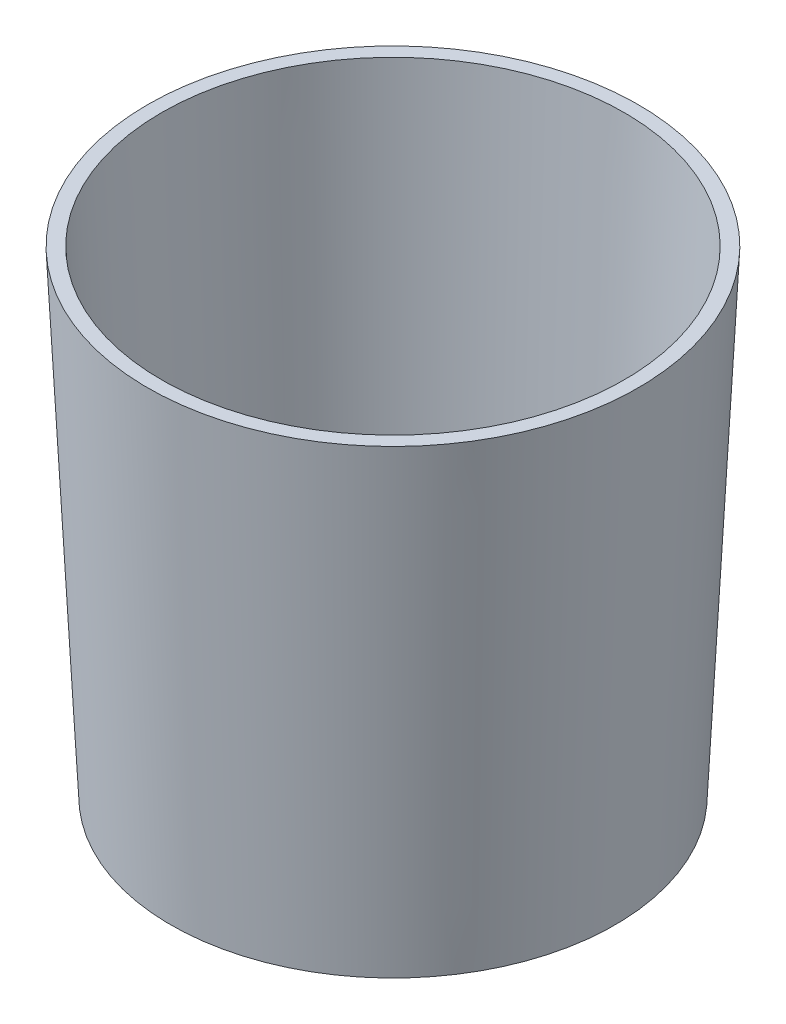
ISO-10303-21;
HEADER;
FILE_DESCRIPTION(('STEP AP214'),'2;1');
FILE_NAME('part.step','',(''),(''),'','','');
FILE_SCHEMA(('AUTOMOTIVE_DESIGN { 1 0 10303 214 1 1 1 1 }'));
ENDSEC;
DATA;
#1=APPLICATION_CONTEXT('core data for automotive mechanical design processes');
#2=APPLICATION_PROTOCOL_DEFINITION('international standard','automotive_design',2000,#1);
#3=PRODUCT_CONTEXT('',#1,'mechanical');
#4=PRODUCT('Part','Part','',(#3));
#5=PRODUCT_RELATED_PRODUCT_CATEGORY('part','',(#4));
#6=PRODUCT_DEFINITION_FORMATION('','',#4);
#7=PRODUCT_DEFINITION_CONTEXT('part definition',#1,'design');
#8=PRODUCT_DEFINITION('design','',#6,#7);
#9=PRODUCT_DEFINITION_SHAPE('','',#8);
#10=(LENGTH_UNIT() NAMED_UNIT(*) SI_UNIT(.MILLI.,.METRE.));
#11=(NAMED_UNIT(*) PLANE_ANGLE_UNIT() SI_UNIT($,.RADIAN.));
#12=(NAMED_UNIT(*) SI_UNIT($,.STERADIAN.) SOLID_ANGLE_UNIT());
#13=UNCERTAINTY_MEASURE_WITH_UNIT(LENGTH_MEASURE(1.E-05),#10,'distance_accuracy_value','');
#14=(GEOMETRIC_REPRESENTATION_CONTEXT(3) GLOBAL_UNCERTAINTY_ASSIGNED_CONTEXT((#13)) GLOBAL_UNIT_ASSIGNED_CONTEXT((#10,
#11,#12)) REPRESENTATION_CONTEXT('',''));
#15=CARTESIAN_POINT('',(0.,0.,0.));
#16=DIRECTION('',(0.,0.,1.));
#17=DIRECTION('',(1.,0.,0.));
#18=AXIS2_PLACEMENT_3D('',#15,#16,#17);
#19=CARTESIAN_POINT('',(53.,36.75,0.));
#20=DIRECTION('',(0.,-1.,0.));
#21=DIRECTION('',(1.,0.,0.));
#22=AXIS2_PLACEMENT_3D('',#19,#20,#21);
#23=PLANE('',#22);
#24=CARTESIAN_POINT('',(0.,36.75,0.));
#25=DIRECTION('',(0.,1.,0.));
#26=DIRECTION('',(-1.,0.,0.));
#27=AXIS2_PLACEMENT_3D('',#24,#25,#26);
#28=CIRCLE('',#27,50.);
#29=CARTESIAN_POINT('',(-50.,36.75,0.));
#30=VERTEX_POINT('',#29);
#31=EDGE_CURVE('E52',#30,#30,#28,.T.);
#32=ORIENTED_EDGE('',*,*,#31,.F.);
#33=EDGE_LOOP('',(#32));
#34=FACE_BOUND('',#33,.T.);
#35=CARTESIAN_POINT('',(0.,36.75,0.));
#36=DIRECTION('',(0.,1.,0.));
#37=DIRECTION('',(-1.,0.,0.));
#38=AXIS2_PLACEMENT_3D('',#35,#36,#37);
#39=CIRCLE('',#38,53.);
#40=CARTESIAN_POINT('',(-53.,36.75,0.));
#41=VERTEX_POINT('',#40);
#42=EDGE_CURVE('E44',#41,#41,#39,.T.);
#43=ORIENTED_EDGE('',*,*,#42,.T.);
#44=EDGE_LOOP('',(#43));
#45=FACE_BOUND('',#44,.T.);
#46=ADVANCED_FACE('F39',(#34,#45),#23,.F.);
#47=CARTESIAN_POINT('',(0.,-66.25,0.));
#48=DIRECTION('',(0.,1.,0.));
#49=DIRECTION('',(-1.,0.,0.));
#50=AXIS2_PLACEMENT_3D('',#47,#48,#49);
#51=PLANE('',#50);
#52=CARTESIAN_POINT('',(0.,-66.25,0.));
#53=DIRECTION('',(0.,1.,0.));
#54=DIRECTION('',(-1.,0.,0.));
#55=AXIS2_PLACEMENT_3D('',#52,#53,#54);
#56=CIRCLE('',#55,48.);
#57=CARTESIAN_POINT('',(-48.,-66.25,0.));
#58=VERTEX_POINT('',#57);
#59=EDGE_CURVE('E10',#58,#58,#56,.T.);
#60=ORIENTED_EDGE('',*,*,#59,.F.);
#61=EDGE_LOOP('',(#60));
#62=FACE_BOUND('',#61,.T.);
#63=ADVANCED_FACE('F64',(#62),#51,.F.);
#64=CARTESIAN_POINT('',(0.,-66.25,0.));
#65=DIRECTION('',(0.,1.,0.));
#66=DIRECTION('',(-1.,0.,0.));
#67=AXIS2_PLACEMENT_3D('',#64,#65,#66);
#68=CONICAL_SURFACE('',#67,48.,0.0485056122403834);
#69=ORIENTED_EDGE('',*,*,#42,.F.);
#70=EDGE_LOOP('',(#69));
#71=FACE_BOUND('',#70,.T.);
#72=ORIENTED_EDGE('',*,*,#59,.T.);
#73=EDGE_LOOP('',(#72));
#74=FACE_BOUND('',#73,.T.);
#75=ADVANCED_FACE('F66',(#71,#74),#68,.T.);
#76=CARTESIAN_POINT('',(0.,36.75,0.));
#77=DIRECTION('',(0.,1.,0.));
#78=DIRECTION('',(-1.,0.,0.));
#79=AXIS2_PLACEMENT_3D('',#76,#77,#78);
#80=CONICAL_SURFACE('',#79,50.,0.0453785605518527);
#81=CARTESIAN_POINT('',(0.,-63.25,0.));
#82=DIRECTION('',(0.,1.,0.));
#83=DIRECTION('',(-1.,0.,0.));
#84=AXIS2_PLACEMENT_3D('',#81,#82,#83);
#85=CIRCLE('',#84,45.4590265718481);
#86=CARTESIAN_POINT('',(-45.4590265718481,-63.25,0.));
#87=VERTEX_POINT('',#86);
#88=EDGE_CURVE('E47',#87,#87,#85,.T.);
#89=ORIENTED_EDGE('',*,*,#88,.F.);
#90=EDGE_LOOP('',(#89));
#91=FACE_BOUND('',#90,.T.);
#92=ORIENTED_EDGE('',*,*,#31,.T.);
#93=EDGE_LOOP('',(#92));
#94=FACE_BOUND('',#93,.T.);
#95=ADVANCED_FACE('F56',(#91,#94),#80,.F.);
#96=CARTESIAN_POINT('',(0.,-63.25,0.));
#97=DIRECTION('',(0.,1.,0.));
#98=DIRECTION('',(-1.,0.,0.));
#99=AXIS2_PLACEMENT_3D('',#96,#97,#98);
#100=PLANE('',#99);
#101=ORIENTED_EDGE('',*,*,#88,.T.);
#102=EDGE_LOOP('',(#101));
#103=FACE_BOUND('',#102,.T.);
#104=ADVANCED_FACE('F78',(#103),#100,.T.);
#105=CLOSED_SHELL('',(#46,#63,#75,#95,#104));
#106=MANIFOLD_SOLID_BREP('B2',#105);
#107=ADVANCED_BREP_SHAPE_REPRESENTATION('',(#18,#106),#14);
#108=SHAPE_DEFINITION_REPRESENTATION(#9,#107);
ENDSEC;
END-ISO-10303-21;
